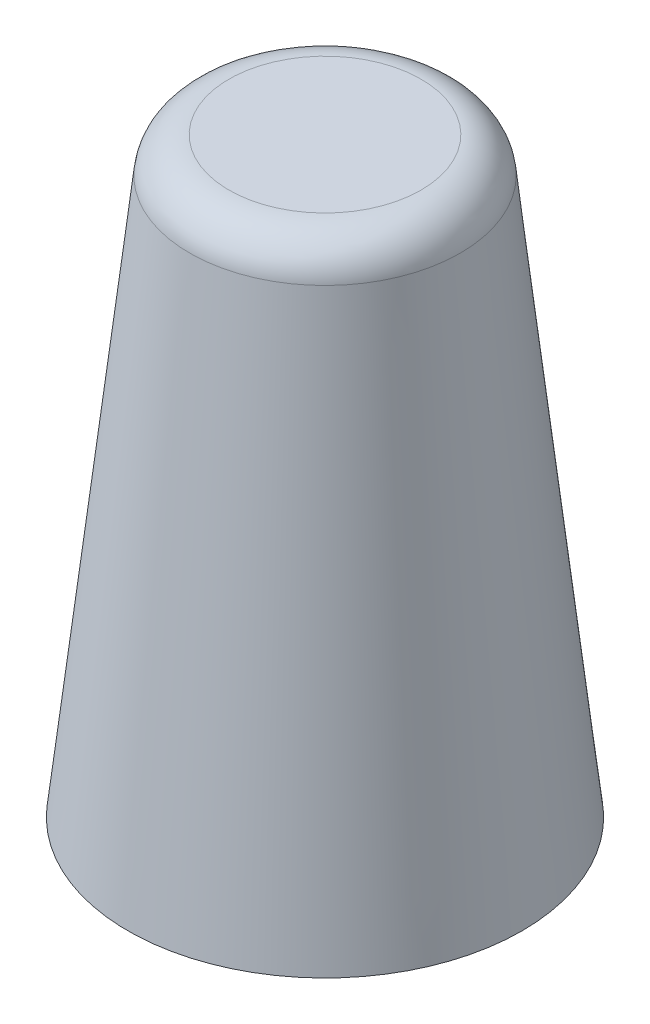
ISO-10303-21;
HEADER;
FILE_DESCRIPTION(('STEP AP214'),'2;1');
FILE_NAME('part.step','',(''),(''),'','','');
FILE_SCHEMA(('AUTOMOTIVE_DESIGN { 1 0 10303 214 1 1 1 1 }'));
ENDSEC;
DATA;
#1=APPLICATION_CONTEXT('core data for automotive mechanical design processes');
#2=APPLICATION_PROTOCOL_DEFINITION('international standard','automotive_design',2000,#1);
#3=PRODUCT_CONTEXT('',#1,'mechanical');
#4=PRODUCT('Part','Part','',(#3));
#5=PRODUCT_RELATED_PRODUCT_CATEGORY('part','',(#4));
#6=PRODUCT_DEFINITION_FORMATION('','',#4);
#7=PRODUCT_DEFINITION_CONTEXT('part definition',#1,'design');
#8=PRODUCT_DEFINITION('design','',#6,#7);
#9=PRODUCT_DEFINITION_SHAPE('','',#8);
#10=(LENGTH_UNIT() NAMED_UNIT(*) SI_UNIT(.MILLI.,.METRE.));
#11=(NAMED_UNIT(*) PLANE_ANGLE_UNIT() SI_UNIT($,.RADIAN.));
#12=(NAMED_UNIT(*) SI_UNIT($,.STERADIAN.) SOLID_ANGLE_UNIT());
#13=UNCERTAINTY_MEASURE_WITH_UNIT(LENGTH_MEASURE(1.E-05),#10,'distance_accuracy_value','');
#14=(GEOMETRIC_REPRESENTATION_CONTEXT(3) GLOBAL_UNCERTAINTY_ASSIGNED_CONTEXT((#13)) GLOBAL_UNIT_ASSIGNED_CONTEXT((#10,
#11,#12)) REPRESENTATION_CONTEXT('',''));
#15=CARTESIAN_POINT('',(0.,0.,0.));
#16=DIRECTION('',(0.,0.,1.));
#17=DIRECTION('',(1.,0.,0.));
#18=AXIS2_PLACEMENT_3D('',#15,#16,#17);
#19=CARTESIAN_POINT('',(0.,0.,0.));
#20=DIRECTION('',(0.,-1.,0.));
#21=DIRECTION('',(1.,0.,0.));
#22=AXIS2_PLACEMENT_3D('',#19,#20,#21);
#23=PLANE('',#22);
#24=CARTESIAN_POINT('',(0.,0.,0.));
#25=DIRECTION('',(0.,-1.,0.));
#26=DIRECTION('',(1.,0.,0.));
#27=AXIS2_PLACEMENT_3D('',#24,#25,#26);
#28=CIRCLE('',#27,15.);
#29=CARTESIAN_POINT('',(15.,0.,0.));
#30=VERTEX_POINT('',#29);
#31=EDGE_CURVE('E10',#30,#30,#28,.T.);
#32=ORIENTED_EDGE('',*,*,#31,.T.);
#33=EDGE_LOOP('',(#32));
#34=FACE_BOUND('',#33,.T.);
#35=ADVANCED_FACE('F33',(#34),#23,.T.);
#36=CARTESIAN_POINT('',(0.,0.,0.));
#37=DIRECTION('',(0.,-1.,0.));
#38=DIRECTION('',(1.,0.,0.));
#39=AXIS2_PLACEMENT_3D('',#36,#37,#38);
#40=CONICAL_SURFACE('',#39,15.,0.110657221173892);
#41=CARTESIAN_POINT('',(-1.45206880848493E-13,42.3312945782245,0.));
#42=DIRECTION('',(0.,-1.,0.));
#43=DIRECTION('',(1.,0.,0.));
#44=AXIS2_PLACEMENT_3D('',#41,#42,#43);
#45=CIRCLE('',#44,10.2965228246419);
#46=CARTESIAN_POINT('',(10.2965228246417,42.3312945782245,0.));
#47=VERTEX_POINT('',#46);
#48=EDGE_CURVE('E39',#47,#47,#45,.T.);
#49=ORIENTED_EDGE('',*,*,#48,.T.);
#50=EDGE_LOOP('',(#49));
#51=FACE_BOUND('',#50,.T.);
#52=ORIENTED_EDGE('',*,*,#31,.F.);
#53=EDGE_LOOP('',(#52));
#54=FACE_BOUND('',#53,.T.);
#55=ADVANCED_FACE('F59',(#51,#54),#40,.T.);
#56=CARTESIAN_POINT('',(-1.43982048506075E-13,42.,0.));
#57=DIRECTION('',(0.,-1.,0.));
#58=DIRECTION('',(1.,0.,0.));
#59=AXIS2_PLACEMENT_3D('',#56,#57,#58);
#60=TOROIDAL_SURFACE('',#59,7.314871620621,3.);
#61=CARTESIAN_POINT('',(-1.54361204949859E-13,45.,0.));
#62=DIRECTION('',(0.,-1.,0.));
#63=DIRECTION('',(1.,0.,0.));
#64=AXIS2_PLACEMENT_3D('',#61,#62,#63);
#65=CIRCLE('',#64,7.314871620621);
#66=CARTESIAN_POINT('',(7.31487162062084,45.,0.));
#67=VERTEX_POINT('',#66);
#68=EDGE_CURVE('E43',#67,#67,#65,.T.);
#69=ORIENTED_EDGE('',*,*,#68,.T.);
#70=EDGE_LOOP('',(#69));
#71=FACE_BOUND('',#70,.T.);
#72=ORIENTED_EDGE('',*,*,#48,.F.);
#73=EDGE_LOOP('',(#72));
#74=FACE_BOUND('',#73,.T.);
#75=ADVANCED_FACE('F50',(#71,#74),#60,.T.);
#76=CARTESIAN_POINT('',(7.31487162062084,45.,0.));
#77=DIRECTION('',(0.,1.,0.));
#78=DIRECTION('',(-1.,0.,0.));
#79=AXIS2_PLACEMENT_3D('',#76,#77,#78);
#80=PLANE('',#79);
#81=ORIENTED_EDGE('',*,*,#68,.F.);
#82=EDGE_LOOP('',(#81));
#83=FACE_BOUND('',#82,.T.);
#84=ADVANCED_FACE('F53',(#83),#80,.T.);
#85=CLOSED_SHELL('',(#35,#55,#75,#84));
#86=MANIFOLD_SOLID_BREP('B2',#85);
#87=ADVANCED_BREP_SHAPE_REPRESENTATION('',(#18,#86),#14);
#88=SHAPE_DEFINITION_REPRESENTATION(#9,#87);
ENDSEC;
END-ISO-10303-21;
